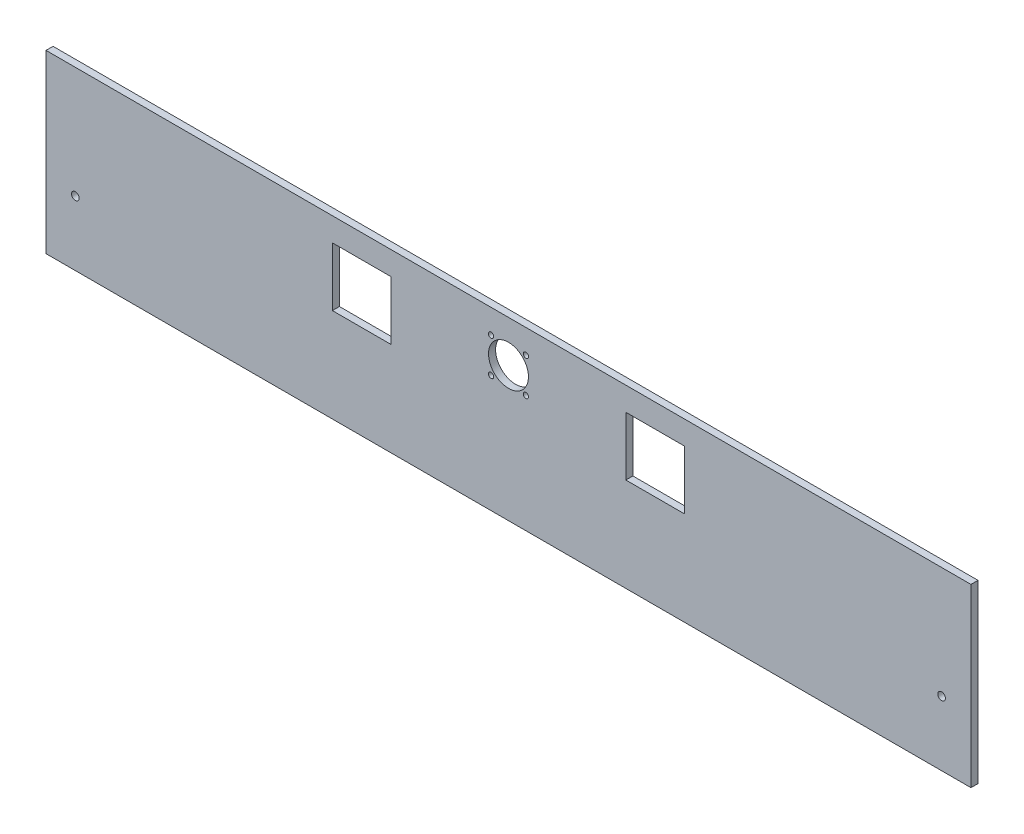
ISO-10303-21;
HEADER;
FILE_DESCRIPTION(('STEP AP214'),'2;1');
FILE_NAME('part.step','',(''),(''),'','','');
FILE_SCHEMA(('AUTOMOTIVE_DESIGN { 1 0 10303 214 1 1 1 1 }'));
ENDSEC;
DATA;
#1=APPLICATION_CONTEXT('core data for automotive mechanical design processes');
#2=APPLICATION_PROTOCOL_DEFINITION('international standard','automotive_design',2000,#1);
#3=PRODUCT_CONTEXT('',#1,'mechanical');
#4=PRODUCT('Part','Part','',(#3));
#5=PRODUCT_RELATED_PRODUCT_CATEGORY('part','',(#4));
#6=PRODUCT_DEFINITION_FORMATION('','',#4);
#7=PRODUCT_DEFINITION_CONTEXT('part definition',#1,'design');
#8=PRODUCT_DEFINITION('design','',#6,#7);
#9=PRODUCT_DEFINITION_SHAPE('','',#8);
#10=(LENGTH_UNIT() NAMED_UNIT(*) SI_UNIT(.MILLI.,.METRE.));
#11=(NAMED_UNIT(*) PLANE_ANGLE_UNIT() SI_UNIT($,.RADIAN.));
#12=(NAMED_UNIT(*) SI_UNIT($,.STERADIAN.) SOLID_ANGLE_UNIT());
#13=UNCERTAINTY_MEASURE_WITH_UNIT(LENGTH_MEASURE(1.E-05),#10,'distance_accuracy_value','');
#14=(GEOMETRIC_REPRESENTATION_CONTEXT(3) GLOBAL_UNCERTAINTY_ASSIGNED_CONTEXT((#13)) GLOBAL_UNIT_ASSIGNED_CONTEXT((#10,
#11,#12)) REPRESENTATION_CONTEXT('',''));
#15=CARTESIAN_POINT('',(0.,0.,0.));
#16=DIRECTION('',(0.,0.,1.));
#17=DIRECTION('',(1.,0.,0.));
#18=AXIS2_PLACEMENT_3D('',#15,#16,#17);
#19=CARTESIAN_POINT('',(394.,-75.,-6.));
#20=DIRECTION('',(1.,0.,0.));
#21=DIRECTION('',(0.,0.,-1.));
#22=AXIS2_PLACEMENT_3D('',#19,#20,#21);
#23=PLANE('',#22);
#24=DIRECTION('',(0.,1.,0.));
#25=VECTOR('',#24,1.);
#26=CARTESIAN_POINT('',(394.,-75.,0.));
#27=LINE('',#26,#25);
#28=CARTESIAN_POINT('',(394.,-75.,0.));
#29=VERTEX_POINT('',#28);
#30=CARTESIAN_POINT('',(394.,75.,0.));
#31=VERTEX_POINT('',#30);
#32=EDGE_CURVE('E225',#29,#31,#27,.T.);
#33=ORIENTED_EDGE('',*,*,#32,.F.);
#34=DIRECTION('',(0.,0.,1.));
#35=VECTOR('',#34,1.);
#36=CARTESIAN_POINT('',(394.,-75.,-6.));
#37=LINE('',#36,#35);
#38=CARTESIAN_POINT('',(394.,-75.,-6.));
#39=VERTEX_POINT('',#38);
#40=EDGE_CURVE('E11',#39,#29,#37,.T.);
#41=ORIENTED_EDGE('',*,*,#40,.F.);
#42=DIRECTION('',(0.,1.,0.));
#43=VECTOR('',#42,1.);
#44=CARTESIAN_POINT('',(394.,-75.,-6.));
#45=LINE('',#44,#43);
#46=CARTESIAN_POINT('',(394.,75.,-6.));
#47=VERTEX_POINT('',#46);
#48=EDGE_CURVE('E228',#39,#47,#45,.T.);
#49=ORIENTED_EDGE('',*,*,#48,.T.);
#50=DIRECTION('',(0.,0.,1.));
#51=VECTOR('',#50,1.);
#52=CARTESIAN_POINT('',(394.,75.,-6.));
#53=LINE('',#52,#51);
#54=EDGE_CURVE('E38',#47,#31,#53,.T.);
#55=ORIENTED_EDGE('',*,*,#54,.T.);
#56=EDGE_LOOP('',(#33,#41,#49,#55));
#57=FACE_BOUND('',#56,.T.);
#58=ADVANCED_FACE('F35',(#57),#23,.T.);
#59=CARTESIAN_POINT('',(-394.,-75.,-6.));
#60=DIRECTION('',(0.,-1.,0.));
#61=DIRECTION('',(0.,0.,-1.));
#62=AXIS2_PLACEMENT_3D('',#59,#60,#61);
#63=PLANE('',#62);
#64=DIRECTION('',(1.,0.,0.));
#65=VECTOR('',#64,1.);
#66=CARTESIAN_POINT('',(-394.,-75.,0.));
#67=LINE('',#66,#65);
#68=CARTESIAN_POINT('',(-394.,-75.,0.));
#69=VERTEX_POINT('',#68);
#70=EDGE_CURVE('E232',#69,#29,#67,.T.);
#71=ORIENTED_EDGE('',*,*,#70,.F.);
#72=DIRECTION('',(0.,0.,1.));
#73=VECTOR('',#72,1.);
#74=CARTESIAN_POINT('',(-394.,-75.,-6.));
#75=LINE('',#74,#73);
#76=CARTESIAN_POINT('',(-394.,-75.,-6.));
#77=VERTEX_POINT('',#76);
#78=EDGE_CURVE('E43',#77,#69,#75,.T.);
#79=ORIENTED_EDGE('',*,*,#78,.F.);
#80=DIRECTION('',(1.,0.,0.));
#81=VECTOR('',#80,1.);
#82=CARTESIAN_POINT('',(-394.,-75.,-6.));
#83=LINE('',#82,#81);
#84=EDGE_CURVE('E238',#77,#39,#83,.T.);
#85=ORIENTED_EDGE('',*,*,#84,.T.);
#86=ORIENTED_EDGE('',*,*,#40,.T.);
#87=EDGE_LOOP('',(#71,#79,#85,#86));
#88=FACE_BOUND('',#87,.T.);
#89=ADVANCED_FACE('F264',(#88),#63,.T.);
#90=CARTESIAN_POINT('',(-394.,-75.,-6.));
#91=DIRECTION('',(-1.,0.,0.));
#92=DIRECTION('',(0.,0.,1.));
#93=AXIS2_PLACEMENT_3D('',#90,#91,#92);
#94=PLANE('',#93);
#95=DIRECTION('',(0.,-1.,0.));
#96=VECTOR('',#95,1.);
#97=CARTESIAN_POINT('',(-394.,-75.,0.));
#98=LINE('',#97,#96);
#99=CARTESIAN_POINT('',(-394.,75.,0.));
#100=VERTEX_POINT('',#99);
#101=EDGE_CURVE('E246',#100,#69,#98,.T.);
#102=ORIENTED_EDGE('',*,*,#101,.F.);
#103=DIRECTION('',(0.,0.,1.));
#104=VECTOR('',#103,1.);
#105=CARTESIAN_POINT('',(-394.,75.,-6.));
#106=LINE('',#105,#104);
#107=CARTESIAN_POINT('',(-394.,75.,-6.));
#108=VERTEX_POINT('',#107);
#109=EDGE_CURVE('E251',#108,#100,#106,.T.);
#110=ORIENTED_EDGE('',*,*,#109,.F.);
#111=DIRECTION('',(0.,-1.,0.));
#112=VECTOR('',#111,1.);
#113=CARTESIAN_POINT('',(-394.,-75.,-6.));
#114=LINE('',#113,#112);
#115=EDGE_CURVE('E235',#108,#77,#114,.T.);
#116=ORIENTED_EDGE('',*,*,#115,.T.);
#117=ORIENTED_EDGE('',*,*,#78,.T.);
#118=EDGE_LOOP('',(#102,#110,#116,#117));
#119=FACE_BOUND('',#118,.T.);
#120=ADVANCED_FACE('F269',(#119),#94,.T.);
#121=CARTESIAN_POINT('',(-394.,75.,-6.));
#122=DIRECTION('',(0.,1.,0.));
#123=DIRECTION('',(0.,0.,1.));
#124=AXIS2_PLACEMENT_3D('',#121,#122,#123);
#125=PLANE('',#124);
#126=DIRECTION('',(-1.,0.,0.));
#127=VECTOR('',#126,1.);
#128=CARTESIAN_POINT('',(-394.,75.,0.));
#129=LINE('',#128,#127);
#130=EDGE_CURVE('E243',#31,#100,#129,.T.);
#131=ORIENTED_EDGE('',*,*,#130,.F.);
#132=ORIENTED_EDGE('',*,*,#54,.F.);
#133=DIRECTION('',(-1.,0.,0.));
#134=VECTOR('',#133,1.);
#135=CARTESIAN_POINT('',(-394.,75.,-6.));
#136=LINE('',#135,#134);
#137=EDGE_CURVE('E231',#47,#108,#136,.T.);
#138=ORIENTED_EDGE('',*,*,#137,.T.);
#139=ORIENTED_EDGE('',*,*,#109,.T.);
#140=EDGE_LOOP('',(#131,#132,#138,#139));
#141=FACE_BOUND('',#140,.T.);
#142=ADVANCED_FACE('F259',(#141),#125,.T.);
#143=CARTESIAN_POINT('',(0.,0.,-6.));
#144=DIRECTION('',(0.,0.,-1.));
#145=DIRECTION('',(-1.,0.,0.));
#146=AXIS2_PLACEMENT_3D('',#143,#144,#145);
#147=PLANE('',#146);
#148=CARTESIAN_POINT('',(369.,-19.9999999999999,-6.));
#149=DIRECTION('',(0.,0.,-1.));
#150=DIRECTION('',(-1.,0.,0.));
#151=AXIS2_PLACEMENT_3D('',#148,#149,#150);
#152=CIRCLE('',#151,3.24999999999995);
#153=CARTESIAN_POINT('',(365.75,-19.9999999999999,-6.));
#154=VERTEX_POINT('',#153);
#155=EDGE_CURVE('E152',#154,#154,#152,.T.);
#156=ORIENTED_EDGE('',*,*,#155,.F.);
#157=EDGE_LOOP('',(#156));
#158=FACE_BOUND('',#157,.T.);
#159=CARTESIAN_POINT('',(-369.,-20.,-6.));
#160=DIRECTION('',(0.,0.,-1.));
#161=DIRECTION('',(-1.,0.,0.));
#162=AXIS2_PLACEMENT_3D('',#159,#160,#161);
#163=CIRCLE('',#162,3.24999999999995);
#164=CARTESIAN_POINT('',(-372.25,-20.,-6.));
#165=VERTEX_POINT('',#164);
#166=EDGE_CURVE('E471',#165,#165,#163,.T.);
#167=ORIENTED_EDGE('',*,*,#166,.F.);
#168=EDGE_LOOP('',(#167));
#169=FACE_BOUND('',#168,.T.);
#170=DIRECTION('',(0.,1.,0.));
#171=VECTOR('',#170,1.);
#172=CARTESIAN_POINT('',(-100.,4.99999999999999,-6.));
#173=LINE('',#172,#171);
#174=CARTESIAN_POINT('',(-100.,4.99999999999999,-6.));
#175=VERTEX_POINT('',#174);
#176=CARTESIAN_POINT('',(-100.,55.,-6.));
#177=VERTEX_POINT('',#176);
#178=EDGE_CURVE('E182',#175,#177,#173,.T.);
#179=ORIENTED_EDGE('',*,*,#178,.T.);
#180=DIRECTION('',(-1.,0.,0.));
#181=VECTOR('',#180,1.);
#182=CARTESIAN_POINT('',(-150.,55.,-6.));
#183=LINE('',#182,#181);
#184=CARTESIAN_POINT('',(-150.,55.,-6.));
#185=VERTEX_POINT('',#184);
#186=EDGE_CURVE('E185',#177,#185,#183,.T.);
#187=ORIENTED_EDGE('',*,*,#186,.T.);
#188=DIRECTION('',(0.,-1.,0.));
#189=VECTOR('',#188,1.);
#190=CARTESIAN_POINT('',(-150.,4.99999999999999,-6.));
#191=LINE('',#190,#189);
#192=CARTESIAN_POINT('',(-150.,4.99999999999999,-6.));
#193=VERTEX_POINT('',#192);
#194=EDGE_CURVE('E51',#185,#193,#191,.T.);
#195=ORIENTED_EDGE('',*,*,#194,.T.);
#196=DIRECTION('',(1.,0.,0.));
#197=VECTOR('',#196,1.);
#198=CARTESIAN_POINT('',(-150.,4.99999999999999,-6.));
#199=LINE('',#198,#197);
#200=EDGE_CURVE('E190',#193,#175,#199,.T.);
#201=ORIENTED_EDGE('',*,*,#200,.T.);
#202=EDGE_LOOP('',(#179,#187,#195,#201));
#203=FACE_BOUND('',#202,.T.);
#204=CARTESIAN_POINT('',(14.8492424049175,24.8007575950825,-6.));
#205=DIRECTION('',(0.,0.,1.));
#206=DIRECTION('',(1.,0.,0.));
#207=AXIS2_PLACEMENT_3D('',#204,#205,#206);
#208=CIRCLE('',#207,2.25);
#209=CARTESIAN_POINT('',(17.0992424049175,24.8007575950825,-6.));
#210=VERTEX_POINT('',#209);
#211=EDGE_CURVE('E174',#210,#210,#208,.T.);
#212=ORIENTED_EDGE('',*,*,#211,.T.);
#213=EDGE_LOOP('',(#212));
#214=FACE_BOUND('',#213,.T.);
#215=CARTESIAN_POINT('',(-14.8492424049175,24.8007575950825,-6.));
#216=DIRECTION('',(0.,0.,1.));
#217=DIRECTION('',(1.,0.,0.));
#218=AXIS2_PLACEMENT_3D('',#215,#216,#217);
#219=CIRCLE('',#218,2.25);
#220=CARTESIAN_POINT('',(-12.5992424049175,24.8007575950825,-6.));
#221=VERTEX_POINT('',#220);
#222=EDGE_CURVE('E217',#221,#221,#219,.T.);
#223=ORIENTED_EDGE('',*,*,#222,.T.);
#224=EDGE_LOOP('',(#223));
#225=FACE_BOUND('',#224,.T.);
#226=CARTESIAN_POINT('',(-14.8492424049175,54.4992424049175,-6.));
#227=DIRECTION('',(0.,0.,1.));
#228=DIRECTION('',(1.,0.,0.));
#229=AXIS2_PLACEMENT_3D('',#226,#227,#228);
#230=CIRCLE('',#229,2.25);
#231=CARTESIAN_POINT('',(-12.5992424049175,54.4992424049175,-6.));
#232=VERTEX_POINT('',#231);
#233=EDGE_CURVE('E210',#232,#232,#230,.T.);
#234=ORIENTED_EDGE('',*,*,#233,.T.);
#235=EDGE_LOOP('',(#234));
#236=FACE_BOUND('',#235,.T.);
#237=DIRECTION('',(0.,1.,0.));
#238=VECTOR('',#237,1.);
#239=CARTESIAN_POINT('',(150.,4.99999999999999,-6.));
#240=LINE('',#239,#238);
#241=CARTESIAN_POINT('',(150.,4.99999999999999,-6.));
#242=VERTEX_POINT('',#241);
#243=CARTESIAN_POINT('',(150.,55.,-6.));
#244=VERTEX_POINT('',#243);
#245=EDGE_CURVE('E128',#242,#244,#240,.T.);
#246=ORIENTED_EDGE('',*,*,#245,.T.);
#247=DIRECTION('',(-1.,0.,0.));
#248=VECTOR('',#247,1.);
#249=CARTESIAN_POINT('',(100.,55.,-6.));
#250=LINE('',#249,#248);
#251=CARTESIAN_POINT('',(100.,55.,-6.));
#252=VERTEX_POINT('',#251);
#253=EDGE_CURVE('E139',#244,#252,#250,.T.);
#254=ORIENTED_EDGE('',*,*,#253,.T.);
#255=DIRECTION('',(0.,-1.,0.));
#256=VECTOR('',#255,1.);
#257=CARTESIAN_POINT('',(100.,4.99999999999999,-6.));
#258=LINE('',#257,#256);
#259=CARTESIAN_POINT('',(100.,4.99999999999999,-6.));
#260=VERTEX_POINT('',#259);
#261=EDGE_CURVE('E59',#252,#260,#258,.T.);
#262=ORIENTED_EDGE('',*,*,#261,.T.);
#263=DIRECTION('',(1.,0.,0.));
#264=VECTOR('',#263,1.);
#265=CARTESIAN_POINT('',(100.,4.99999999999999,-6.));
#266=LINE('',#265,#264);
#267=EDGE_CURVE('E136',#260,#242,#266,.T.);
#268=ORIENTED_EDGE('',*,*,#267,.T.);
#269=EDGE_LOOP('',(#246,#254,#262,#268));
#270=FACE_BOUND('',#269,.T.);
#271=CARTESIAN_POINT('',(0.,39.65,-6.));
#272=DIRECTION('',(0.,0.,1.));
#273=DIRECTION('',(1.,0.,0.));
#274=AXIS2_PLACEMENT_3D('',#271,#272,#273);
#275=CIRCLE('',#274,17.);
#276=CARTESIAN_POINT('',(17.,39.65,-6.));
#277=VERTEX_POINT('',#276);
#278=EDGE_CURVE('E159',#277,#277,#275,.T.);
#279=ORIENTED_EDGE('',*,*,#278,.T.);
#280=EDGE_LOOP('',(#279));
#281=FACE_BOUND('',#280,.T.);
#282=CARTESIAN_POINT('',(14.8492424049175,54.4992424049175,-6.));
#283=DIRECTION('',(0.,0.,1.));
#284=DIRECTION('',(1.,0.,0.));
#285=AXIS2_PLACEMENT_3D('',#282,#283,#284);
#286=CIRCLE('',#285,2.25);
#287=CARTESIAN_POINT('',(17.0992424049175,54.4992424049175,-6.));
#288=VERTEX_POINT('',#287);
#289=EDGE_CURVE('E222',#288,#288,#286,.T.);
#290=ORIENTED_EDGE('',*,*,#289,.T.);
#291=EDGE_LOOP('',(#290));
#292=FACE_BOUND('',#291,.T.);
#293=ORIENTED_EDGE('',*,*,#48,.F.);
#294=ORIENTED_EDGE('',*,*,#84,.F.);
#295=ORIENTED_EDGE('',*,*,#115,.F.);
#296=ORIENTED_EDGE('',*,*,#137,.F.);
#297=EDGE_LOOP('',(#293,#294,#295,#296));
#298=FACE_BOUND('',#297,.T.);
#299=ADVANCED_FACE('F143',(#158,#169,#203,#214,#225,#236,#270,#281,#292,#298),#147,.T.);
#300=CARTESIAN_POINT('',(0.,0.,0.));
#301=DIRECTION('',(0.,0.,-1.));
#302=DIRECTION('',(-1.,0.,0.));
#303=AXIS2_PLACEMENT_3D('',#300,#301,#302);
#304=PLANE('',#303);
#305=CARTESIAN_POINT('',(369.,-19.9999999999999,0.));
#306=DIRECTION('',(0.,0.,1.));
#307=DIRECTION('',(1.,0.,0.));
#308=AXIS2_PLACEMENT_3D('',#305,#306,#307);
#309=CIRCLE('',#308,3.24999999999995);
#310=CARTESIAN_POINT('',(372.25,-19.9999999999999,0.));
#311=VERTEX_POINT('',#310);
#312=EDGE_CURVE('E470',#311,#311,#309,.T.);
#313=ORIENTED_EDGE('',*,*,#312,.F.);
#314=EDGE_LOOP('',(#313));
#315=FACE_BOUND('',#314,.T.);
#316=CARTESIAN_POINT('',(-369.,-20.,0.));
#317=DIRECTION('',(0.,0.,1.));
#318=DIRECTION('',(1.,0.,0.));
#319=AXIS2_PLACEMENT_3D('',#316,#317,#318);
#320=CIRCLE('',#319,3.24999999999995);
#321=CARTESIAN_POINT('',(-365.75,-20.,0.));
#322=VERTEX_POINT('',#321);
#323=EDGE_CURVE('E472',#322,#322,#320,.T.);
#324=ORIENTED_EDGE('',*,*,#323,.F.);
#325=EDGE_LOOP('',(#324));
#326=FACE_BOUND('',#325,.T.);
#327=DIRECTION('',(-1.,0.,0.));
#328=VECTOR('',#327,1.);
#329=CARTESIAN_POINT('',(-150.,55.,0.));
#330=LINE('',#329,#328);
#331=CARTESIAN_POINT('',(-100.,55.,0.));
#332=VERTEX_POINT('',#331);
#333=CARTESIAN_POINT('',(-150.,55.,0.));
#334=VERTEX_POINT('',#333);
#335=EDGE_CURVE('E195',#332,#334,#330,.T.);
#336=ORIENTED_EDGE('',*,*,#335,.F.);
#337=DIRECTION('',(0.,1.,0.));
#338=VECTOR('',#337,1.);
#339=CARTESIAN_POINT('',(-100.,4.99999999999999,0.));
#340=LINE('',#339,#338);
#341=CARTESIAN_POINT('',(-100.,4.99999999999999,0.));
#342=VERTEX_POINT('',#341);
#343=EDGE_CURVE('E165',#342,#332,#340,.T.);
#344=ORIENTED_EDGE('',*,*,#343,.F.);
#345=DIRECTION('',(1.,0.,0.));
#346=VECTOR('',#345,1.);
#347=CARTESIAN_POINT('',(-150.,4.99999999999999,0.));
#348=LINE('',#347,#346);
#349=CARTESIAN_POINT('',(-150.,4.99999999999999,0.));
#350=VERTEX_POINT('',#349);
#351=EDGE_CURVE('E186',#350,#342,#348,.T.);
#352=ORIENTED_EDGE('',*,*,#351,.F.);
#353=DIRECTION('',(0.,-1.,0.));
#354=VECTOR('',#353,1.);
#355=CARTESIAN_POINT('',(-150.,4.99999999999999,0.));
#356=LINE('',#355,#354);
#357=EDGE_CURVE('E198',#334,#350,#356,.T.);
#358=ORIENTED_EDGE('',*,*,#357,.F.);
#359=EDGE_LOOP('',(#336,#344,#352,#358));
#360=FACE_BOUND('',#359,.T.);
#361=CARTESIAN_POINT('',(14.8492424049175,24.8007575950825,0.));
#362=DIRECTION('',(0.,0.,1.));
#363=DIRECTION('',(1.,0.,0.));
#364=AXIS2_PLACEMENT_3D('',#361,#362,#363);
#365=CIRCLE('',#364,2.25);
#366=CARTESIAN_POINT('',(17.0992424049175,24.8007575950825,0.));
#367=VERTEX_POINT('',#366);
#368=EDGE_CURVE('E178',#367,#367,#365,.T.);
#369=ORIENTED_EDGE('',*,*,#368,.F.);
#370=EDGE_LOOP('',(#369));
#371=FACE_BOUND('',#370,.T.);
#372=CARTESIAN_POINT('',(-14.8492424049175,24.8007575950825,0.));
#373=DIRECTION('',(0.,0.,1.));
#374=DIRECTION('',(1.,0.,0.));
#375=AXIS2_PLACEMENT_3D('',#372,#373,#374);
#376=CIRCLE('',#375,2.25);
#377=CARTESIAN_POINT('',(-12.5992424049175,24.8007575950825,0.));
#378=VERTEX_POINT('',#377);
#379=EDGE_CURVE('E177',#378,#378,#376,.T.);
#380=ORIENTED_EDGE('',*,*,#379,.F.);
#381=EDGE_LOOP('',(#380));
#382=FACE_BOUND('',#381,.T.);
#383=CARTESIAN_POINT('',(-14.8492424049175,54.4992424049175,0.));
#384=DIRECTION('',(0.,0.,1.));
#385=DIRECTION('',(1.,0.,0.));
#386=AXIS2_PLACEMENT_3D('',#383,#384,#385);
#387=CIRCLE('',#386,2.25);
#388=CARTESIAN_POINT('',(-12.5992424049175,54.4992424049175,0.));
#389=VERTEX_POINT('',#388);
#390=EDGE_CURVE('E214',#389,#389,#387,.T.);
#391=ORIENTED_EDGE('',*,*,#390,.F.);
#392=EDGE_LOOP('',(#391));
#393=FACE_BOUND('',#392,.T.);
#394=DIRECTION('',(-1.,0.,0.));
#395=VECTOR('',#394,1.);
#396=CARTESIAN_POINT('',(100.,55.,0.));
#397=LINE('',#396,#395);
#398=CARTESIAN_POINT('',(150.,55.,0.));
#399=VERTEX_POINT('',#398);
#400=CARTESIAN_POINT('',(100.,55.,0.));
#401=VERTEX_POINT('',#400);
#402=EDGE_CURVE('E158',#399,#401,#397,.T.);
#403=ORIENTED_EDGE('',*,*,#402,.F.);
#404=DIRECTION('',(0.,1.,0.));
#405=VECTOR('',#404,1.);
#406=CARTESIAN_POINT('',(150.,4.99999999999999,0.));
#407=LINE('',#406,#405);
#408=CARTESIAN_POINT('',(150.,4.99999999999999,0.));
#409=VERTEX_POINT('',#408);
#410=EDGE_CURVE('E131',#409,#399,#407,.T.);
#411=ORIENTED_EDGE('',*,*,#410,.F.);
#412=DIRECTION('',(1.,0.,0.));
#413=VECTOR('',#412,1.);
#414=CARTESIAN_POINT('',(100.,4.99999999999999,0.));
#415=LINE('',#414,#413);
#416=CARTESIAN_POINT('',(100.,4.99999999999999,0.));
#417=VERTEX_POINT('',#416);
#418=EDGE_CURVE('E146',#417,#409,#415,.T.);
#419=ORIENTED_EDGE('',*,*,#418,.F.);
#420=DIRECTION('',(0.,-1.,0.));
#421=VECTOR('',#420,1.);
#422=CARTESIAN_POINT('',(100.,4.99999999999999,0.));
#423=LINE('',#422,#421);
#424=EDGE_CURVE('E149',#401,#417,#423,.T.);
#425=ORIENTED_EDGE('',*,*,#424,.F.);
#426=EDGE_LOOP('',(#403,#411,#419,#425));
#427=FACE_BOUND('',#426,.T.);
#428=CARTESIAN_POINT('',(0.,39.65,0.));
#429=DIRECTION('',(0.,0.,1.));
#430=DIRECTION('',(1.,0.,0.));
#431=AXIS2_PLACEMENT_3D('',#428,#429,#430);
#432=CIRCLE('',#431,17.);
#433=CARTESIAN_POINT('',(17.,39.65,0.));
#434=VERTEX_POINT('',#433);
#435=EDGE_CURVE('E171',#434,#434,#432,.T.);
#436=ORIENTED_EDGE('',*,*,#435,.F.);
#437=EDGE_LOOP('',(#436));
#438=FACE_BOUND('',#437,.T.);
#439=CARTESIAN_POINT('',(14.8492424049175,54.4992424049175,0.));
#440=DIRECTION('',(0.,0.,1.));
#441=DIRECTION('',(1.,0.,0.));
#442=AXIS2_PLACEMENT_3D('',#439,#440,#441);
#443=CIRCLE('',#442,2.25);
#444=CARTESIAN_POINT('',(17.0992424049175,54.4992424049175,0.));
#445=VERTEX_POINT('',#444);
#446=EDGE_CURVE('E213',#445,#445,#443,.T.);
#447=ORIENTED_EDGE('',*,*,#446,.F.);
#448=EDGE_LOOP('',(#447));
#449=FACE_BOUND('',#448,.T.);
#450=ORIENTED_EDGE('',*,*,#32,.T.);
#451=ORIENTED_EDGE('',*,*,#130,.T.);
#452=ORIENTED_EDGE('',*,*,#101,.T.);
#453=ORIENTED_EDGE('',*,*,#70,.T.);
#454=EDGE_LOOP('',(#450,#451,#452,#453));
#455=FACE_BOUND('',#454,.T.);
#456=ADVANCED_FACE('F261',(#315,#326,#360,#371,#382,#393,#427,#438,#449,#455),#304,.F.);
#457=CARTESIAN_POINT('',(14.8492424049175,54.4992424049175,-6.));
#458=DIRECTION('',(0.,0.,1.));
#459=DIRECTION('',(1.,0.,0.));
#460=AXIS2_PLACEMENT_3D('',#457,#458,#459);
#461=CYLINDRICAL_SURFACE('',#460,2.25);
#462=ORIENTED_EDGE('',*,*,#289,.F.);
#463=EDGE_LOOP('',(#462));
#464=FACE_BOUND('',#463,.T.);
#465=ORIENTED_EDGE('',*,*,#446,.T.);
#466=EDGE_LOOP('',(#465));
#467=FACE_BOUND('',#466,.T.);
#468=ADVANCED_FACE('F304',(#464,#467),#461,.F.);
#469=CARTESIAN_POINT('',(0.,39.65,-6.));
#470=DIRECTION('',(0.,0.,1.));
#471=DIRECTION('',(1.,0.,0.));
#472=AXIS2_PLACEMENT_3D('',#469,#470,#471);
#473=CYLINDRICAL_SURFACE('',#472,17.);
#474=ORIENTED_EDGE('',*,*,#278,.F.);
#475=EDGE_LOOP('',(#474));
#476=FACE_BOUND('',#475,.T.);
#477=ORIENTED_EDGE('',*,*,#435,.T.);
#478=EDGE_LOOP('',(#477));
#479=FACE_BOUND('',#478,.T.);
#480=ADVANCED_FACE('F309',(#476,#479),#473,.F.);
#481=CARTESIAN_POINT('',(150.,4.99999999999999,-6.));
#482=DIRECTION('',(1.,0.,0.));
#483=DIRECTION('',(0.,0.,-1.));
#484=AXIS2_PLACEMENT_3D('',#481,#482,#483);
#485=PLANE('',#484);
#486=ORIENTED_EDGE('',*,*,#410,.T.);
#487=DIRECTION('',(0.,0.,1.));
#488=VECTOR('',#487,1.);
#489=CARTESIAN_POINT('',(150.,55.,-6.));
#490=LINE('',#489,#488);
#491=EDGE_CURVE('E124',#244,#399,#490,.T.);
#492=ORIENTED_EDGE('',*,*,#491,.F.);
#493=ORIENTED_EDGE('',*,*,#245,.F.);
#494=DIRECTION('',(0.,0.,1.));
#495=VECTOR('',#494,1.);
#496=CARTESIAN_POINT('',(150.,4.99999999999999,-6.));
#497=LINE('',#496,#495);
#498=EDGE_CURVE('E163',#242,#409,#497,.T.);
#499=ORIENTED_EDGE('',*,*,#498,.T.);
#500=EDGE_LOOP('',(#486,#492,#493,#499));
#501=FACE_BOUND('',#500,.T.);
#502=ADVANCED_FACE('F126',(#501),#485,.F.);
#503=CARTESIAN_POINT('',(100.,4.99999999999999,-6.));
#504=DIRECTION('',(0.,-1.,0.));
#505=DIRECTION('',(0.,0.,-1.));
#506=AXIS2_PLACEMENT_3D('',#503,#504,#505);
#507=PLANE('',#506);
#508=ORIENTED_EDGE('',*,*,#418,.T.);
#509=ORIENTED_EDGE('',*,*,#498,.F.);
#510=ORIENTED_EDGE('',*,*,#267,.F.);
#511=DIRECTION('',(0.,0.,1.));
#512=VECTOR('',#511,1.);
#513=CARTESIAN_POINT('',(100.,4.99999999999999,-6.));
#514=LINE('',#513,#512);
#515=EDGE_CURVE('E166',#260,#417,#514,.T.);
#516=ORIENTED_EDGE('',*,*,#515,.T.);
#517=EDGE_LOOP('',(#508,#509,#510,#516));
#518=FACE_BOUND('',#517,.T.);
#519=ADVANCED_FACE('F330',(#518),#507,.F.);
#520=CARTESIAN_POINT('',(100.,4.99999999999999,-6.));
#521=DIRECTION('',(-1.,0.,0.));
#522=DIRECTION('',(0.,0.,1.));
#523=AXIS2_PLACEMENT_3D('',#520,#521,#522);
#524=PLANE('',#523);
#525=ORIENTED_EDGE('',*,*,#424,.T.);
#526=ORIENTED_EDGE('',*,*,#515,.F.);
#527=ORIENTED_EDGE('',*,*,#261,.F.);
#528=DIRECTION('',(0.,0.,1.));
#529=VECTOR('',#528,1.);
#530=CARTESIAN_POINT('',(100.,55.,-6.));
#531=LINE('',#530,#529);
#532=EDGE_CURVE('E135',#252,#401,#531,.T.);
#533=ORIENTED_EDGE('',*,*,#532,.T.);
#534=EDGE_LOOP('',(#525,#526,#527,#533));
#535=FACE_BOUND('',#534,.T.);
#536=ADVANCED_FACE('F339',(#535),#524,.F.);
#537=CARTESIAN_POINT('',(100.,55.,-6.));
#538=DIRECTION('',(0.,1.,0.));
#539=DIRECTION('',(0.,0.,1.));
#540=AXIS2_PLACEMENT_3D('',#537,#538,#539);
#541=PLANE('',#540);
#542=ORIENTED_EDGE('',*,*,#402,.T.);
#543=ORIENTED_EDGE('',*,*,#532,.F.);
#544=ORIENTED_EDGE('',*,*,#253,.F.);
#545=ORIENTED_EDGE('',*,*,#491,.T.);
#546=EDGE_LOOP('',(#542,#543,#544,#545));
#547=FACE_BOUND('',#546,.T.);
#548=ADVANCED_FACE('F140',(#547),#541,.F.);
#549=CARTESIAN_POINT('',(-14.8492424049175,54.4992424049175,-6.));
#550=DIRECTION('',(0.,0.,1.));
#551=DIRECTION('',(1.,0.,0.));
#552=AXIS2_PLACEMENT_3D('',#549,#550,#551);
#553=CYLINDRICAL_SURFACE('',#552,2.25);
#554=ORIENTED_EDGE('',*,*,#233,.F.);
#555=EDGE_LOOP('',(#554));
#556=FACE_BOUND('',#555,.T.);
#557=ORIENTED_EDGE('',*,*,#390,.T.);
#558=EDGE_LOOP('',(#557));
#559=FACE_BOUND('',#558,.T.);
#560=ADVANCED_FACE('F357',(#556,#559),#553,.F.);
#561=CARTESIAN_POINT('',(-14.8492424049175,24.8007575950825,-6.));
#562=DIRECTION('',(0.,0.,1.));
#563=DIRECTION('',(1.,0.,0.));
#564=AXIS2_PLACEMENT_3D('',#561,#562,#563);
#565=CYLINDRICAL_SURFACE('',#564,2.25);
#566=ORIENTED_EDGE('',*,*,#222,.F.);
#567=EDGE_LOOP('',(#566));
#568=FACE_BOUND('',#567,.T.);
#569=ORIENTED_EDGE('',*,*,#379,.T.);
#570=EDGE_LOOP('',(#569));
#571=FACE_BOUND('',#570,.T.);
#572=ADVANCED_FACE('F366',(#568,#571),#565,.F.);
#573=CARTESIAN_POINT('',(14.8492424049175,24.8007575950825,-6.));
#574=DIRECTION('',(0.,0.,1.));
#575=DIRECTION('',(1.,0.,0.));
#576=AXIS2_PLACEMENT_3D('',#573,#574,#575);
#577=CYLINDRICAL_SURFACE('',#576,2.25);
#578=ORIENTED_EDGE('',*,*,#211,.F.);
#579=EDGE_LOOP('',(#578));
#580=FACE_BOUND('',#579,.T.);
#581=ORIENTED_EDGE('',*,*,#368,.T.);
#582=EDGE_LOOP('',(#581));
#583=FACE_BOUND('',#582,.T.);
#584=ADVANCED_FACE('F376',(#580,#583),#577,.F.);
#585=CARTESIAN_POINT('',(-100.,4.99999999999999,-6.));
#586=DIRECTION('',(1.,0.,0.));
#587=DIRECTION('',(0.,0.,-1.));
#588=AXIS2_PLACEMENT_3D('',#585,#586,#587);
#589=PLANE('',#588);
#590=ORIENTED_EDGE('',*,*,#343,.T.);
#591=DIRECTION('',(0.,0.,1.));
#592=VECTOR('',#591,1.);
#593=CARTESIAN_POINT('',(-100.,55.,-6.));
#594=LINE('',#593,#592);
#595=EDGE_CURVE('E193',#177,#332,#594,.T.);
#596=ORIENTED_EDGE('',*,*,#595,.F.);
#597=ORIENTED_EDGE('',*,*,#178,.F.);
#598=DIRECTION('',(0.,0.,1.));
#599=VECTOR('',#598,1.);
#600=CARTESIAN_POINT('',(-100.,4.99999999999999,-6.));
#601=LINE('',#600,#599);
#602=EDGE_CURVE('E181',#175,#342,#601,.T.);
#603=ORIENTED_EDGE('',*,*,#602,.T.);
#604=EDGE_LOOP('',(#590,#596,#597,#603));
#605=FACE_BOUND('',#604,.T.);
#606=ADVANCED_FACE('F386',(#605),#589,.F.);
#607=CARTESIAN_POINT('',(-150.,4.99999999999999,-6.));
#608=DIRECTION('',(0.,-1.,0.));
#609=DIRECTION('',(0.,0.,-1.));
#610=AXIS2_PLACEMENT_3D('',#607,#608,#609);
#611=PLANE('',#610);
#612=ORIENTED_EDGE('',*,*,#351,.T.);
#613=ORIENTED_EDGE('',*,*,#602,.F.);
#614=ORIENTED_EDGE('',*,*,#200,.F.);
#615=DIRECTION('',(0.,0.,1.));
#616=VECTOR('',#615,1.);
#617=CARTESIAN_POINT('',(-150.,4.99999999999999,-6.));
#618=LINE('',#617,#616);
#619=EDGE_CURVE('E204',#193,#350,#618,.T.);
#620=ORIENTED_EDGE('',*,*,#619,.T.);
#621=EDGE_LOOP('',(#612,#613,#614,#620));
#622=FACE_BOUND('',#621,.T.);
#623=ADVANCED_FACE('F396',(#622),#611,.F.);
#624=CARTESIAN_POINT('',(-150.,4.99999999999999,-6.));
#625=DIRECTION('',(-1.,0.,0.));
#626=DIRECTION('',(0.,0.,1.));
#627=AXIS2_PLACEMENT_3D('',#624,#625,#626);
#628=PLANE('',#627);
#629=ORIENTED_EDGE('',*,*,#357,.T.);
#630=ORIENTED_EDGE('',*,*,#619,.F.);
#631=ORIENTED_EDGE('',*,*,#194,.F.);
#632=DIRECTION('',(0.,0.,1.));
#633=VECTOR('',#632,1.);
#634=CARTESIAN_POINT('',(-150.,55.,-6.));
#635=LINE('',#634,#633);
#636=EDGE_CURVE('E206',#185,#334,#635,.T.);
#637=ORIENTED_EDGE('',*,*,#636,.T.);
#638=EDGE_LOOP('',(#629,#630,#631,#637));
#639=FACE_BOUND('',#638,.T.);
#640=ADVANCED_FACE('F406',(#639),#628,.F.);
#641=CARTESIAN_POINT('',(-150.,55.,-6.));
#642=DIRECTION('',(0.,1.,0.));
#643=DIRECTION('',(0.,0.,1.));
#644=AXIS2_PLACEMENT_3D('',#641,#642,#643);
#645=PLANE('',#644);
#646=ORIENTED_EDGE('',*,*,#335,.T.);
#647=ORIENTED_EDGE('',*,*,#636,.F.);
#648=ORIENTED_EDGE('',*,*,#186,.F.);
#649=ORIENTED_EDGE('',*,*,#595,.T.);
#650=EDGE_LOOP('',(#646,#647,#648,#649));
#651=FACE_BOUND('',#650,.T.);
#652=ADVANCED_FACE('F416',(#651),#645,.F.);
#653=CARTESIAN_POINT('',(-369.,-20.,-10.));
#654=DIRECTION('',(0.,0.,1.));
#655=DIRECTION('',(1.,0.,0.));
#656=AXIS2_PLACEMENT_3D('',#653,#654,#655);
#657=CYLINDRICAL_SURFACE('',#656,3.24999999999995);
#658=ORIENTED_EDGE('',*,*,#166,.T.);
#659=EDGE_LOOP('',(#658));
#660=FACE_BOUND('',#659,.T.);
#661=ORIENTED_EDGE('',*,*,#323,.T.);
#662=EDGE_LOOP('',(#661));
#663=FACE_BOUND('',#662,.T.);
#664=ADVANCED_FACE('F425',(#660,#663),#657,.F.);
#665=CARTESIAN_POINT('',(369.,-19.9999999999999,-10.));
#666=DIRECTION('',(0.,0.,1.));
#667=DIRECTION('',(1.,0.,0.));
#668=AXIS2_PLACEMENT_3D('',#665,#666,#667);
#669=CYLINDRICAL_SURFACE('',#668,3.24999999999995);
#670=ORIENTED_EDGE('',*,*,#155,.T.);
#671=EDGE_LOOP('',(#670));
#672=FACE_BOUND('',#671,.T.);
#673=ORIENTED_EDGE('',*,*,#312,.T.);
#674=EDGE_LOOP('',(#673));
#675=FACE_BOUND('',#674,.T.);
#676=ADVANCED_FACE('F451',(#672,#675),#669,.F.);
#677=CLOSED_SHELL('',(#58,#89,#120,#142,#299,#456,#468,#480,#502,#519,#536,#548,#560,#572,#584,
#606,#623,#640,#652,#664,#676));
#678=MANIFOLD_SOLID_BREP('B2',#677);
#679=ADVANCED_BREP_SHAPE_REPRESENTATION('',(#18,#678),#14);
#680=SHAPE_DEFINITION_REPRESENTATION(#9,#679);
ENDSEC;
END-ISO-10303-21;
